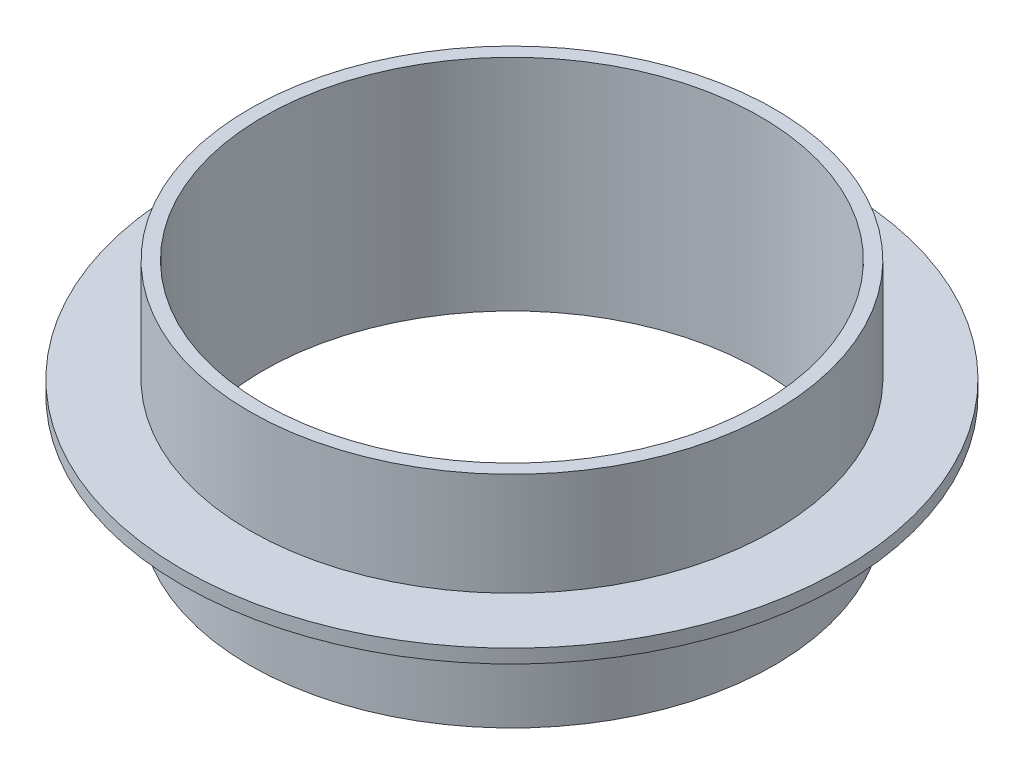
ISO-10303-21;
HEADER;
FILE_DESCRIPTION(('STEP AP214'),'2;1');
FILE_NAME('part.step','',(''),(''),'','','');
FILE_SCHEMA(('AUTOMOTIVE_DESIGN { 1 0 10303 214 1 1 1 1 }'));
ENDSEC;
DATA;
#1=APPLICATION_CONTEXT('core data for automotive mechanical design processes');
#2=APPLICATION_PROTOCOL_DEFINITION('international standard','automotive_design',2000,#1);
#3=PRODUCT_CONTEXT('',#1,'mechanical');
#4=PRODUCT('Part','Part','',(#3));
#5=PRODUCT_RELATED_PRODUCT_CATEGORY('part','',(#4));
#6=PRODUCT_DEFINITION_FORMATION('','',#4);
#7=PRODUCT_DEFINITION_CONTEXT('part definition',#1,'design');
#8=PRODUCT_DEFINITION('design','',#6,#7);
#9=PRODUCT_DEFINITION_SHAPE('','',#8);
#10=(LENGTH_UNIT() NAMED_UNIT(*) SI_UNIT(.MILLI.,.METRE.));
#11=(NAMED_UNIT(*) PLANE_ANGLE_UNIT() SI_UNIT($,.RADIAN.));
#12=(NAMED_UNIT(*) SI_UNIT($,.STERADIAN.) SOLID_ANGLE_UNIT());
#13=UNCERTAINTY_MEASURE_WITH_UNIT(LENGTH_MEASURE(1.E-05),#10,'distance_accuracy_value','');
#14=(GEOMETRIC_REPRESENTATION_CONTEXT(3) GLOBAL_UNCERTAINTY_ASSIGNED_CONTEXT((#13)) GLOBAL_UNIT_ASSIGNED_CONTEXT((#10,
#11,#12)) REPRESENTATION_CONTEXT('',''));
#15=CARTESIAN_POINT('',(0.,0.,0.));
#16=DIRECTION('',(0.,0.,1.));
#17=DIRECTION('',(1.,0.,0.));
#18=AXIS2_PLACEMENT_3D('',#15,#16,#17);
#19=CARTESIAN_POINT('',(0.,50.8,0.));
#20=DIRECTION('',(0.,-1.,0.));
#21=DIRECTION('',(0.,0.,-1.));
#22=AXIS2_PLACEMENT_3D('',#19,#20,#21);
#23=CYLINDRICAL_SURFACE('',#22,60.6425);
#24=CARTESIAN_POINT('',(0.,0.,0.));
#25=DIRECTION('',(0.,1.,0.));
#26=DIRECTION('',(0.,0.,1.));
#27=AXIS2_PLACEMENT_3D('',#24,#25,#26);
#28=CIRCLE('',#27,60.6425);
#29=CARTESIAN_POINT('',(0.,0.,60.6425));
#30=VERTEX_POINT('',#29);
#31=EDGE_CURVE('E49',#30,#30,#28,.T.);
#32=ORIENTED_EDGE('',*,*,#31,.T.);
#33=EDGE_LOOP('',(#32));
#34=FACE_BOUND('',#33,.T.);
#35=CARTESIAN_POINT('',(0.,23.8125,0.));
#36=DIRECTION('',(0.,1.,0.));
#37=DIRECTION('',(0.,0.,1.));
#38=AXIS2_PLACEMENT_3D('',#35,#36,#37);
#39=CIRCLE('',#38,60.6425);
#40=CARTESIAN_POINT('',(0.,23.8125,60.6425));
#41=VERTEX_POINT('',#40);
#42=EDGE_CURVE('E10',#41,#41,#39,.T.);
#43=ORIENTED_EDGE('',*,*,#42,.F.);
#44=EDGE_LOOP('',(#43));
#45=FACE_BOUND('',#44,.T.);
#46=ADVANCED_FACE('F34',(#34,#45),#23,.T.);
#47=CARTESIAN_POINT('',(0.,50.8,0.));
#48=DIRECTION('',(0.,1.,0.));
#49=DIRECTION('',(0.,0.,1.));
#50=AXIS2_PLACEMENT_3D('',#47,#48,#49);
#51=PLANE('',#50);
#52=CARTESIAN_POINT('',(0.,50.8,0.));
#53=DIRECTION('',(0.,1.,0.));
#54=DIRECTION('',(0.,0.,1.));
#55=AXIS2_PLACEMENT_3D('',#52,#53,#54);
#56=CIRCLE('',#55,60.6425);
#57=CARTESIAN_POINT('',(0.,50.8,60.6425));
#58=VERTEX_POINT('',#57);
#59=EDGE_CURVE('E42',#58,#58,#56,.T.);
#60=ORIENTED_EDGE('',*,*,#59,.T.);
#61=EDGE_LOOP('',(#60));
#62=FACE_BOUND('',#61,.T.);
#63=CARTESIAN_POINT('',(0.,50.8,0.));
#64=DIRECTION('',(0.,1.,0.));
#65=DIRECTION('',(0.,0.,1.));
#66=AXIS2_PLACEMENT_3D('',#63,#64,#65);
#67=CIRCLE('',#66,57.4675);
#68=CARTESIAN_POINT('',(0.,50.8,57.4675));
#69=VERTEX_POINT('',#68);
#70=EDGE_CURVE('E55',#69,#69,#67,.T.);
#71=ORIENTED_EDGE('',*,*,#70,.F.);
#72=EDGE_LOOP('',(#71));
#73=FACE_BOUND('',#72,.T.);
#74=ADVANCED_FACE('F109',(#62,#73),#51,.T.);
#75=CARTESIAN_POINT('',(0.,0.,0.));
#76=DIRECTION('',(0.,1.,0.));
#77=DIRECTION('',(0.,0.,1.));
#78=AXIS2_PLACEMENT_3D('',#75,#76,#77);
#79=PLANE('',#78);
#80=ORIENTED_EDGE('',*,*,#31,.F.);
#81=EDGE_LOOP('',(#80));
#82=FACE_BOUND('',#81,.T.);
#83=CARTESIAN_POINT('',(0.,0.,0.));
#84=DIRECTION('',(0.,1.,0.));
#85=DIRECTION('',(0.,0.,1.));
#86=AXIS2_PLACEMENT_3D('',#83,#84,#85);
#87=CIRCLE('',#86,57.4675);
#88=CARTESIAN_POINT('',(0.,0.,57.4675));
#89=VERTEX_POINT('',#88);
#90=EDGE_CURVE('E57',#89,#89,#87,.T.);
#91=ORIENTED_EDGE('',*,*,#90,.T.);
#92=EDGE_LOOP('',(#91));
#93=FACE_BOUND('',#92,.T.);
#94=ADVANCED_FACE('F113',(#82,#93),#79,.F.);
#95=CARTESIAN_POINT('',(0.,26.9875,0.));
#96=DIRECTION('',(0.,1.,0.));
#97=DIRECTION('',(0.,0.,1.));
#98=AXIS2_PLACEMENT_3D('',#95,#96,#97);
#99=CIRCLE('',#98,60.6425);
#100=CARTESIAN_POINT('',(0.,26.9875,60.6425));
#101=VERTEX_POINT('',#100);
#102=EDGE_CURVE('E68',#101,#101,#99,.T.);
#103=ORIENTED_EDGE('',*,*,#102,.T.);
#104=EDGE_LOOP('',(#103));
#105=FACE_BOUND('',#104,.T.);
#106=ORIENTED_EDGE('',*,*,#59,.F.);
#107=EDGE_LOOP('',(#106));
#108=FACE_BOUND('',#107,.T.);
#109=ADVANCED_FACE('F36',(#105,#108),#23,.T.);
#110=CARTESIAN_POINT('',(0.,50.8,0.));
#111=DIRECTION('',(0.,-1.,0.));
#112=DIRECTION('',(0.,0.,-1.));
#113=AXIS2_PLACEMENT_3D('',#110,#111,#112);
#114=CYLINDRICAL_SURFACE('',#113,57.4675);
#115=ORIENTED_EDGE('',*,*,#70,.T.);
#116=EDGE_LOOP('',(#115));
#117=FACE_BOUND('',#116,.T.);
#118=ORIENTED_EDGE('',*,*,#90,.F.);
#119=EDGE_LOOP('',(#118));
#120=FACE_BOUND('',#119,.T.);
#121=ADVANCED_FACE('F97',(#117,#120),#114,.F.);
#122=CARTESIAN_POINT('',(0.,23.8125,0.));
#123=DIRECTION('',(0.,1.,0.));
#124=DIRECTION('',(0.,0.,1.));
#125=AXIS2_PLACEMENT_3D('',#122,#123,#124);
#126=CYLINDRICAL_SURFACE('',#125,76.2);
#127=CARTESIAN_POINT('',(0.,23.8125,0.));
#128=DIRECTION('',(0.,1.,0.));
#129=DIRECTION('',(0.,0.,1.));
#130=AXIS2_PLACEMENT_3D('',#127,#128,#129);
#131=CIRCLE('',#130,76.2);
#132=CARTESIAN_POINT('',(0.,23.8125,76.2));
#133=VERTEX_POINT('',#132);
#134=EDGE_CURVE('E61',#133,#133,#131,.T.);
#135=ORIENTED_EDGE('',*,*,#134,.T.);
#136=EDGE_LOOP('',(#135));
#137=FACE_BOUND('',#136,.T.);
#138=CARTESIAN_POINT('',(0.,26.9875,0.));
#139=DIRECTION('',(0.,1.,0.));
#140=DIRECTION('',(0.,0.,1.));
#141=AXIS2_PLACEMENT_3D('',#138,#139,#140);
#142=CIRCLE('',#141,76.2);
#143=CARTESIAN_POINT('',(0.,26.9875,76.2));
#144=VERTEX_POINT('',#143);
#145=EDGE_CURVE('E64',#144,#144,#142,.T.);
#146=ORIENTED_EDGE('',*,*,#145,.F.);
#147=EDGE_LOOP('',(#146));
#148=FACE_BOUND('',#147,.T.);
#149=ADVANCED_FACE('F95',(#137,#148),#126,.T.);
#150=CARTESIAN_POINT('',(0.,23.8125,0.));
#151=DIRECTION('',(0.,1.,0.));
#152=DIRECTION('',(0.,0.,1.));
#153=AXIS2_PLACEMENT_3D('',#150,#151,#152);
#154=PLANE('',#153);
#155=CARTESIAN_POINT('',(-68.42125,23.8125,0.));
#156=DIRECTION('',(0.,1.,0.));
#157=DIRECTION('',(0.,0.,1.));
#158=AXIS2_PLACEMENT_3D('',#155,#156,#157);
#159=CIRCLE('',#158,3.26389999999999);
#160=CARTESIAN_POINT('',(-68.42125,23.8125,3.26389999999999));
#161=VERTEX_POINT('',#160);
#162=EDGE_CURVE('E74',#161,#161,#159,.T.);
#163=ORIENTED_EDGE('',*,*,#162,.T.);
#164=EDGE_LOOP('',(#163));
#165=FACE_BOUND('',#164,.T.);
#166=ORIENTED_EDGE('',*,*,#42,.T.);
#167=EDGE_LOOP('',(#166));
#168=FACE_BOUND('',#167,.T.);
#169=ORIENTED_EDGE('',*,*,#134,.F.);
#170=EDGE_LOOP('',(#169));
#171=FACE_BOUND('',#170,.T.);
#172=ADVANCED_FACE('F89',(#165,#168,#171),#154,.F.);
#173=CARTESIAN_POINT('',(0.,26.9875,0.));
#174=DIRECTION('',(0.,1.,0.));
#175=DIRECTION('',(0.,0.,1.));
#176=AXIS2_PLACEMENT_3D('',#173,#174,#175);
#177=PLANE('',#176);
#178=CARTESIAN_POINT('',(-68.42125,26.9875,0.));
#179=DIRECTION('',(0.,1.,0.));
#180=DIRECTION('',(0.,0.,1.));
#181=AXIS2_PLACEMENT_3D('',#178,#179,#180);
#182=CIRCLE('',#181,3.2639);
#183=CARTESIAN_POINT('',(-68.42125,26.9875,3.2639));
#184=VERTEX_POINT('',#183);
#185=EDGE_CURVE('E78',#184,#184,#182,.T.);
#186=ORIENTED_EDGE('',*,*,#185,.F.);
#187=EDGE_LOOP('',(#186));
#188=FACE_BOUND('',#187,.T.);
#189=ORIENTED_EDGE('',*,*,#102,.F.);
#190=EDGE_LOOP('',(#189));
#191=FACE_BOUND('',#190,.T.);
#192=ORIENTED_EDGE('',*,*,#145,.T.);
#193=EDGE_LOOP('',(#192));
#194=FACE_BOUND('',#193,.T.);
#195=ADVANCED_FACE('F86',(#188,#191,#194),#177,.T.);
#196=CARTESIAN_POINT('',(-68.42125,26.9875,0.));
#197=DIRECTION('',(0.,1.,0.));
#198=DIRECTION('',(0.,0.,1.));
#199=AXIS2_PLACEMENT_3D('',#196,#197,#198);
#200=CYLINDRICAL_SURFACE('',#199,3.26389999999999);
#201=ORIENTED_EDGE('',*,*,#185,.T.);
#202=EDGE_LOOP('',(#201));
#203=FACE_BOUND('',#202,.T.);
#204=ORIENTED_EDGE('',*,*,#162,.F.);
#205=EDGE_LOOP('',(#204));
#206=FACE_BOUND('',#205,.T.);
#207=ADVANCED_FACE('F83',(#203,#206),#200,.F.);
#208=CLOSED_SHELL('',(#46,#74,#94,#109,#121,#149,#172,#195,#207));
#209=MANIFOLD_SOLID_BREP('B2',#208);
#210=ADVANCED_BREP_SHAPE_REPRESENTATION('',(#18,#209),#14);
#211=SHAPE_DEFINITION_REPRESENTATION(#9,#210);
ENDSEC;
END-ISO-10303-21;
